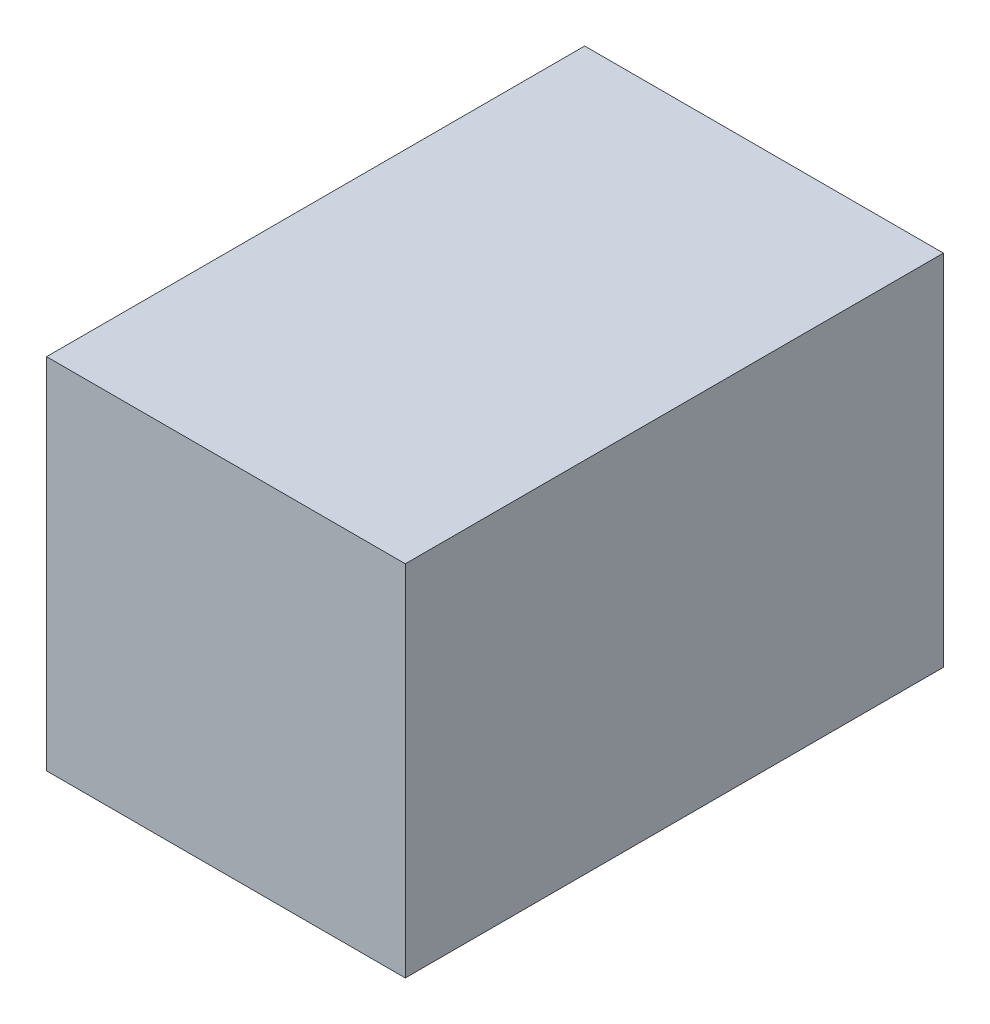
ISO-10303-21;
HEADER;
FILE_DESCRIPTION(('STEP AP214'),'2;1');
FILE_NAME('part.step','',(''),(''),'','','');
FILE_SCHEMA(('AUTOMOTIVE_DESIGN { 1 0 10303 214 1 1 1 1 }'));
ENDSEC;
DATA;
#1=APPLICATION_CONTEXT('core data for automotive mechanical design processes');
#2=APPLICATION_PROTOCOL_DEFINITION('international standard','automotive_design',2000,#1);
#3=PRODUCT_CONTEXT('',#1,'mechanical');
#4=PRODUCT('Part','Part','',(#3));
#5=PRODUCT_RELATED_PRODUCT_CATEGORY('part','',(#4));
#6=PRODUCT_DEFINITION_FORMATION('','',#4);
#7=PRODUCT_DEFINITION_CONTEXT('part definition',#1,'design');
#8=PRODUCT_DEFINITION('design','',#6,#7);
#9=PRODUCT_DEFINITION_SHAPE('','',#8);
#10=(LENGTH_UNIT() NAMED_UNIT(*) SI_UNIT(.MILLI.,.METRE.));
#11=(NAMED_UNIT(*) PLANE_ANGLE_UNIT() SI_UNIT($,.RADIAN.));
#12=(NAMED_UNIT(*) SI_UNIT($,.STERADIAN.) SOLID_ANGLE_UNIT());
#13=UNCERTAINTY_MEASURE_WITH_UNIT(LENGTH_MEASURE(1.E-05),#10,'distance_accuracy_value','');
#14=(GEOMETRIC_REPRESENTATION_CONTEXT(3) GLOBAL_UNCERTAINTY_ASSIGNED_CONTEXT((#13)) GLOBAL_UNIT_ASSIGNED_CONTEXT((#10,
#11,#12)) REPRESENTATION_CONTEXT('',''));
#15=CARTESIAN_POINT('',(0.,0.,0.));
#16=DIRECTION('',(0.,0.,1.));
#17=DIRECTION('',(1.,0.,0.));
#18=AXIS2_PLACEMENT_3D('',#15,#16,#17);
#19=CARTESIAN_POINT('',(-50.8,-50.8,152.4));
#20=DIRECTION('',(1.,0.,0.));
#21=DIRECTION('',(0.,0.,-1.));
#22=AXIS2_PLACEMENT_3D('',#19,#20,#21);
#23=PLANE('',#22);
#24=DIRECTION('',(0.,-1.,0.));
#25=VECTOR('',#24,1.);
#26=CARTESIAN_POINT('',(-50.8,-50.8,0.));
#27=LINE('',#26,#25);
#28=CARTESIAN_POINT('',(-50.8,50.8,0.));
#29=VERTEX_POINT('',#28);
#30=CARTESIAN_POINT('',(-50.8,-50.8,0.));
#31=VERTEX_POINT('',#30);
#32=EDGE_CURVE('E113',#29,#31,#27,.T.);
#33=ORIENTED_EDGE('',*,*,#32,.T.);
#34=DIRECTION('',(0.,0.,-1.));
#35=VECTOR('',#34,1.);
#36=CARTESIAN_POINT('',(-50.8,-50.8,152.4));
#37=LINE('',#36,#35);
#38=CARTESIAN_POINT('',(-50.8,-50.8,152.4));
#39=VERTEX_POINT('',#38);
#40=EDGE_CURVE('E11',#39,#31,#37,.T.);
#41=ORIENTED_EDGE('',*,*,#40,.F.);
#42=DIRECTION('',(0.,-1.,0.));
#43=VECTOR('',#42,1.);
#44=CARTESIAN_POINT('',(-50.8,-50.8,152.4));
#45=LINE('',#44,#43);
#46=CARTESIAN_POINT('',(-50.8,50.8,152.4));
#47=VERTEX_POINT('',#46);
#48=EDGE_CURVE('E97',#47,#39,#45,.T.);
#49=ORIENTED_EDGE('',*,*,#48,.F.);
#50=DIRECTION('',(0.,0.,-1.));
#51=VECTOR('',#50,1.);
#52=CARTESIAN_POINT('',(-50.8,50.8,152.4));
#53=LINE('',#52,#51);
#54=EDGE_CURVE('E109',#47,#29,#53,.T.);
#55=ORIENTED_EDGE('',*,*,#54,.T.);
#56=EDGE_LOOP('',(#33,#41,#49,#55));
#57=FACE_BOUND('',#56,.T.);
#58=ADVANCED_FACE('F45',(#57),#23,.F.);
#59=CARTESIAN_POINT('',(50.8,-50.8,152.4));
#60=DIRECTION('',(0.,1.,0.));
#61=DIRECTION('',(-1.,0.,0.));
#62=AXIS2_PLACEMENT_3D('',#59,#60,#61);
#63=PLANE('',#62);
#64=DIRECTION('',(1.,0.,0.));
#65=VECTOR('',#64,1.);
#66=CARTESIAN_POINT('',(50.8,-50.8,0.));
#67=LINE('',#66,#65);
#68=CARTESIAN_POINT('',(50.8,-50.8,0.));
#69=VERTEX_POINT('',#68);
#70=EDGE_CURVE('E102',#31,#69,#67,.T.);
#71=ORIENTED_EDGE('',*,*,#70,.T.);
#72=DIRECTION('',(0.,0.,-1.));
#73=VECTOR('',#72,1.);
#74=CARTESIAN_POINT('',(50.8,-50.8,152.4));
#75=LINE('',#74,#73);
#76=CARTESIAN_POINT('',(50.8,-50.8,152.4));
#77=VERTEX_POINT('',#76);
#78=EDGE_CURVE('E54',#77,#69,#75,.T.);
#79=ORIENTED_EDGE('',*,*,#78,.F.);
#80=DIRECTION('',(1.,0.,0.));
#81=VECTOR('',#80,1.);
#82=CARTESIAN_POINT('',(50.8,-50.8,152.4));
#83=LINE('',#82,#81);
#84=EDGE_CURVE('E92',#39,#77,#83,.T.);
#85=ORIENTED_EDGE('',*,*,#84,.F.);
#86=ORIENTED_EDGE('',*,*,#40,.T.);
#87=EDGE_LOOP('',(#71,#79,#85,#86));
#88=FACE_BOUND('',#87,.T.);
#89=ADVANCED_FACE('F101',(#88),#63,.F.);
#90=CARTESIAN_POINT('',(50.8,-50.8,152.4));
#91=DIRECTION('',(-1.,0.,0.));
#92=DIRECTION('',(0.,0.,1.));
#93=AXIS2_PLACEMENT_3D('',#90,#91,#92);
#94=PLANE('',#93);
#95=DIRECTION('',(0.,1.,0.));
#96=VECTOR('',#95,1.);
#97=CARTESIAN_POINT('',(50.8,-50.8,0.));
#98=LINE('',#97,#96);
#99=CARTESIAN_POINT('',(50.8,50.8,0.));
#100=VERTEX_POINT('',#99);
#101=EDGE_CURVE('E79',#69,#100,#98,.T.);
#102=ORIENTED_EDGE('',*,*,#101,.T.);
#103=DIRECTION('',(0.,0.,-1.));
#104=VECTOR('',#103,1.);
#105=CARTESIAN_POINT('',(50.8,50.8,152.4));
#106=LINE('',#105,#104);
#107=CARTESIAN_POINT('',(50.8,50.8,152.4));
#108=VERTEX_POINT('',#107);
#109=EDGE_CURVE('E104',#108,#100,#106,.T.);
#110=ORIENTED_EDGE('',*,*,#109,.F.);
#111=DIRECTION('',(0.,1.,0.));
#112=VECTOR('',#111,1.);
#113=CARTESIAN_POINT('',(50.8,-50.8,152.4));
#114=LINE('',#113,#112);
#115=EDGE_CURVE('E95',#77,#108,#114,.T.);
#116=ORIENTED_EDGE('',*,*,#115,.F.);
#117=ORIENTED_EDGE('',*,*,#78,.T.);
#118=EDGE_LOOP('',(#102,#110,#116,#117));
#119=FACE_BOUND('',#118,.T.);
#120=ADVANCED_FACE('F105',(#119),#94,.F.);
#121=CARTESIAN_POINT('',(50.8,50.8,152.4));
#122=DIRECTION('',(0.,-1.,0.));
#123=DIRECTION('',(1.,0.,0.));
#124=AXIS2_PLACEMENT_3D('',#121,#122,#123);
#125=PLANE('',#124);
#126=DIRECTION('',(-1.,0.,0.));
#127=VECTOR('',#126,1.);
#128=CARTESIAN_POINT('',(50.8,50.8,0.));
#129=LINE('',#128,#127);
#130=EDGE_CURVE('E85',#100,#29,#129,.T.);
#131=ORIENTED_EDGE('',*,*,#130,.T.);
#132=ORIENTED_EDGE('',*,*,#54,.F.);
#133=DIRECTION('',(-1.,0.,0.));
#134=VECTOR('',#133,1.);
#135=CARTESIAN_POINT('',(50.8,50.8,152.4));
#136=LINE('',#135,#134);
#137=EDGE_CURVE('E62',#108,#47,#136,.T.);
#138=ORIENTED_EDGE('',*,*,#137,.F.);
#139=ORIENTED_EDGE('',*,*,#109,.T.);
#140=EDGE_LOOP('',(#131,#132,#138,#139));
#141=FACE_BOUND('',#140,.T.);
#142=ADVANCED_FACE('F126',(#141),#125,.F.);
#143=CARTESIAN_POINT('',(0.,0.,152.4));
#144=DIRECTION('',(0.,0.,1.));
#145=DIRECTION('',(1.,0.,0.));
#146=AXIS2_PLACEMENT_3D('',#143,#144,#145);
#147=PLANE('',#146);
#148=ORIENTED_EDGE('',*,*,#48,.T.);
#149=ORIENTED_EDGE('',*,*,#84,.T.);
#150=ORIENTED_EDGE('',*,*,#115,.T.);
#151=ORIENTED_EDGE('',*,*,#137,.T.);
#152=EDGE_LOOP('',(#148,#149,#150,#151));
#153=FACE_BOUND('',#152,.T.);
#154=ADVANCED_FACE('F93',(#153),#147,.T.);
#155=CARTESIAN_POINT('',(0.,0.,0.));
#156=DIRECTION('',(0.,0.,1.));
#157=DIRECTION('',(1.,0.,0.));
#158=AXIS2_PLACEMENT_3D('',#155,#156,#157);
#159=PLANE('',#158);
#160=ORIENTED_EDGE('',*,*,#32,.F.);
#161=ORIENTED_EDGE('',*,*,#130,.F.);
#162=ORIENTED_EDGE('',*,*,#101,.F.);
#163=ORIENTED_EDGE('',*,*,#70,.F.);
#164=EDGE_LOOP('',(#160,#161,#162,#163));
#165=FACE_BOUND('',#164,.T.);
#166=ADVANCED_FACE('F129',(#165),#159,.F.);
#167=CLOSED_SHELL('',(#58,#89,#120,#142,#154,#166));
#168=MANIFOLD_SOLID_BREP('B2',#167);
#169=ADVANCED_BREP_SHAPE_REPRESENTATION('',(#18,#168),#14);
#170=SHAPE_DEFINITION_REPRESENTATION(#9,#169);
ENDSEC;
END-ISO-10303-21;
